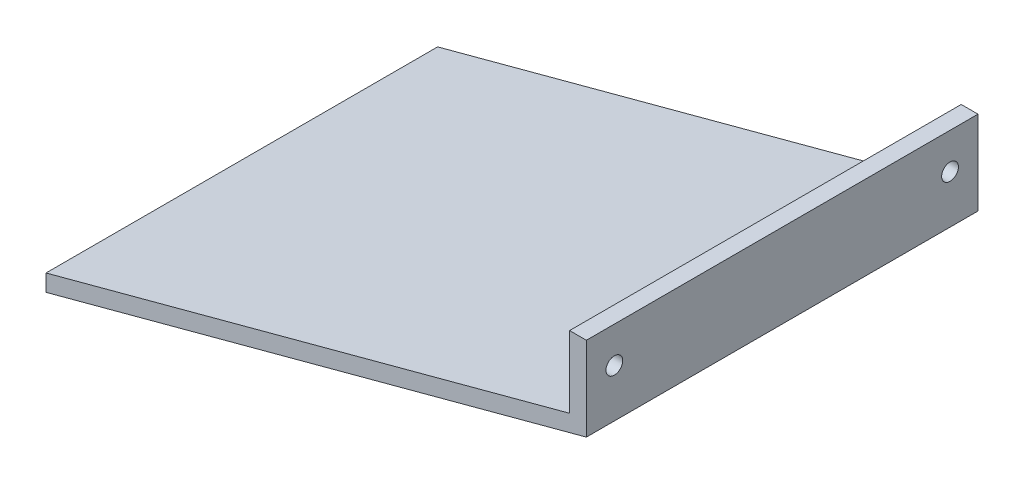
ISO-10303-21;
HEADER;
FILE_DESCRIPTION(('STEP AP214'),'2;1');
FILE_NAME('part.step','',(''),(''),'','','');
FILE_SCHEMA(('AUTOMOTIVE_DESIGN { 1 0 10303 214 1 1 1 1 }'));
ENDSEC;
DATA;
#1=APPLICATION_CONTEXT('core data for automotive mechanical design processes');
#2=APPLICATION_PROTOCOL_DEFINITION('international standard','automotive_design',2000,#1);
#3=PRODUCT_CONTEXT('',#1,'mechanical');
#4=PRODUCT('Part','Part','',(#3));
#5=PRODUCT_RELATED_PRODUCT_CATEGORY('part','',(#4));
#6=PRODUCT_DEFINITION_FORMATION('','',#4);
#7=PRODUCT_DEFINITION_CONTEXT('part definition',#1,'design');
#8=PRODUCT_DEFINITION('design','',#6,#7);
#9=PRODUCT_DEFINITION_SHAPE('','',#8);
#10=(LENGTH_UNIT() NAMED_UNIT(*) SI_UNIT(.MILLI.,.METRE.));
#11=(NAMED_UNIT(*) PLANE_ANGLE_UNIT() SI_UNIT($,.RADIAN.));
#12=(NAMED_UNIT(*) SI_UNIT($,.STERADIAN.) SOLID_ANGLE_UNIT());
#13=UNCERTAINTY_MEASURE_WITH_UNIT(LENGTH_MEASURE(1.E-05),#10,'distance_accuracy_value','');
#14=(GEOMETRIC_REPRESENTATION_CONTEXT(3) GLOBAL_UNCERTAINTY_ASSIGNED_CONTEXT((#13)) GLOBAL_UNIT_ASSIGNED_CONTEXT((#10,
#11,#12)) REPRESENTATION_CONTEXT('',''));
#15=CARTESIAN_POINT('',(0.,0.,0.));
#16=DIRECTION('',(0.,0.,1.));
#17=DIRECTION('',(1.,0.,0.));
#18=AXIS2_PLACEMENT_3D('',#15,#16,#17);
#19=CARTESIAN_POINT('',(-48.9338326903239,-16.6440255352879,70.));
#20=DIRECTION('',(0.258819045102521,-0.965925826289068,0.));
#21=DIRECTION('',(0.965925826289068,0.258819045102521,0.));
#22=AXIS2_PLACEMENT_3D('',#19,#20,#21);
#23=PLANE('',#22);
#24=DIRECTION('',(-0.965925826289068,-0.258819045102521,0.));
#25=VECTOR('',#24,1.);
#26=CARTESIAN_POINT('',(-48.9338326903239,-16.6440255352879,0.));
#27=LINE('',#26,#25);
#28=CARTESIAN_POINT('',(44.6587499385829,8.43403139767086,0.));
#29=VERTEX_POINT('',#28);
#30=CARTESIAN_POINT('',(-48.9338326903239,-16.6440255352879,0.));
#31=VERTEX_POINT('',#30);
#32=EDGE_CURVE('E118',#29,#31,#27,.T.);
#33=ORIENTED_EDGE('',*,*,#32,.T.);
#34=DIRECTION('',(0.,0.,-1.));
#35=VECTOR('',#34,1.);
#36=CARTESIAN_POINT('',(-48.9338326903239,-16.6440255352879,70.));
#37=LINE('',#36,#35);
#38=CARTESIAN_POINT('',(-48.9338326903239,-16.6440255352879,70.));
#39=VERTEX_POINT('',#38);
#40=EDGE_CURVE('E11',#39,#31,#37,.T.);
#41=ORIENTED_EDGE('',*,*,#40,.F.);
#42=DIRECTION('',(-0.965925826289068,-0.258819045102521,0.));
#43=VECTOR('',#42,1.);
#44=CARTESIAN_POINT('',(-48.9338326903239,-16.6440255352879,70.));
#45=LINE('',#44,#43);
#46=CARTESIAN_POINT('',(44.6587499385829,8.43403139767086,70.));
#47=VERTEX_POINT('',#46);
#48=EDGE_CURVE('E130',#47,#39,#45,.T.);
#49=ORIENTED_EDGE('',*,*,#48,.F.);
#50=DIRECTION('',(0.,0.,-1.));
#51=VECTOR('',#50,1.);
#52=CARTESIAN_POINT('',(44.6587499385829,8.43403139767086,70.));
#53=LINE('',#52,#51);
#54=EDGE_CURVE('E114',#47,#29,#53,.T.);
#55=ORIENTED_EDGE('',*,*,#54,.T.);
#56=EDGE_LOOP('',(#33,#41,#49,#55));
#57=FACE_BOUND('',#56,.T.);
#58=ADVANCED_FACE('F35',(#57),#23,.F.);
#59=CARTESIAN_POINT('',(-48.9338326903239,-19.6440255352879,70.));
#60=DIRECTION('',(1.,0.,0.));
#61=DIRECTION('',(0.,0.,-1.));
#62=AXIS2_PLACEMENT_3D('',#59,#60,#61);
#63=PLANE('',#62);
#64=DIRECTION('',(0.,-1.,0.));
#65=VECTOR('',#64,1.);
#66=CARTESIAN_POINT('',(-48.9338326903239,-19.6440255352879,0.));
#67=LINE('',#66,#65);
#68=CARTESIAN_POINT('',(-48.9338326903239,-19.6440255352879,0.));
#69=VERTEX_POINT('',#68);
#70=EDGE_CURVE('E121',#31,#69,#67,.T.);
#71=ORIENTED_EDGE('',*,*,#70,.T.);
#72=DIRECTION('',(0.,0.,-1.));
#73=VECTOR('',#72,1.);
#74=CARTESIAN_POINT('',(-48.9338326903239,-19.6440255352879,70.));
#75=LINE('',#74,#73);
#76=CARTESIAN_POINT('',(-48.9338326903239,-19.6440255352879,70.));
#77=VERTEX_POINT('',#76);
#78=EDGE_CURVE('E43',#77,#69,#75,.T.);
#79=ORIENTED_EDGE('',*,*,#78,.F.);
#80=DIRECTION('',(0.,-1.,0.));
#81=VECTOR('',#80,1.);
#82=CARTESIAN_POINT('',(-48.9338326903239,-19.6440255352879,70.));
#83=LINE('',#82,#81);
#84=EDGE_CURVE('E88',#39,#77,#83,.T.);
#85=ORIENTED_EDGE('',*,*,#84,.F.);
#86=ORIENTED_EDGE('',*,*,#40,.T.);
#87=EDGE_LOOP('',(#71,#79,#85,#86));
#88=FACE_BOUND('',#87,.T.);
#89=ADVANCED_FACE('F157',(#88),#63,.F.);
#90=CARTESIAN_POINT('',(47.6587499385829,6.23787897496424,70.));
#91=DIRECTION('',(-0.258819045102521,0.965925826289068,0.));
#92=DIRECTION('',(-0.965925826289068,-0.258819045102521,0.));
#93=AXIS2_PLACEMENT_3D('',#90,#91,#92);
#94=PLANE('',#93);
#95=DIRECTION('',(0.965925826289068,0.258819045102521,0.));
#96=VECTOR('',#95,1.);
#97=CARTESIAN_POINT('',(47.6587499385829,6.23787897496424,0.));
#98=LINE('',#97,#96);
#99=CARTESIAN_POINT('',(47.6587499385829,6.23787897496424,0.));
#100=VERTEX_POINT('',#99);
#101=EDGE_CURVE('E124',#69,#100,#98,.T.);
#102=ORIENTED_EDGE('',*,*,#101,.T.);
#103=DIRECTION('',(0.,0.,-1.));
#104=VECTOR('',#103,1.);
#105=CARTESIAN_POINT('',(47.6587499385829,6.23787897496424,70.));
#106=LINE('',#105,#104);
#107=CARTESIAN_POINT('',(47.6587499385829,6.23787897496424,70.));
#108=VERTEX_POINT('',#107);
#109=EDGE_CURVE('E109',#108,#100,#106,.T.);
#110=ORIENTED_EDGE('',*,*,#109,.F.);
#111=DIRECTION('',(0.965925826289068,0.258819045102521,0.));
#112=VECTOR('',#111,1.);
#113=CARTESIAN_POINT('',(47.6587499385829,6.23787897496424,70.));
#114=LINE('',#113,#112);
#115=EDGE_CURVE('E101',#77,#108,#114,.T.);
#116=ORIENTED_EDGE('',*,*,#115,.F.);
#117=ORIENTED_EDGE('',*,*,#78,.T.);
#118=EDGE_LOOP('',(#102,#110,#116,#117));
#119=FACE_BOUND('',#118,.T.);
#120=ADVANCED_FACE('F136',(#119),#94,.F.);
#121=CARTESIAN_POINT('',(47.6587499385829,9.23787897496424,70.));
#122=DIRECTION('',(-1.,0.,0.));
#123=DIRECTION('',(0.,0.,1.));
#124=AXIS2_PLACEMENT_3D('',#121,#122,#123);
#125=PLANE('',#124);
#126=CARTESIAN_POINT('',(47.6587499385829,14.8359551863176,65.));
#127=DIRECTION('',(-1.,0.,0.));
#128=DIRECTION('',(0.,0.,1.));
#129=AXIS2_PLACEMENT_3D('',#126,#127,#128);
#130=CIRCLE('',#129,1.5);
#131=CARTESIAN_POINT('',(47.6587499385829,14.8359551863176,66.5));
#132=VERTEX_POINT('',#131);
#133=EDGE_CURVE('E173',#132,#132,#130,.F.);
#134=ORIENTED_EDGE('',*,*,#133,.F.);
#135=EDGE_LOOP('',(#134));
#136=FACE_BOUND('',#135,.T.);
#137=CARTESIAN_POINT('',(47.6587499385829,14.8359551863176,5.));
#138=DIRECTION('',(-1.,0.,0.));
#139=DIRECTION('',(0.,0.,1.));
#140=AXIS2_PLACEMENT_3D('',#137,#138,#139);
#141=CIRCLE('',#140,1.5);
#142=CARTESIAN_POINT('',(47.6587499385829,14.8359551863176,6.5));
#143=VERTEX_POINT('',#142);
#144=EDGE_CURVE('E122',#143,#143,#141,.F.);
#145=ORIENTED_EDGE('',*,*,#144,.F.);
#146=EDGE_LOOP('',(#145));
#147=FACE_BOUND('',#146,.T.);
#148=DIRECTION('',(0.,1.,0.));
#149=VECTOR('',#148,1.);
#150=CARTESIAN_POINT('',(47.6587499385829,9.23787897496424,0.));
#151=LINE('',#150,#149);
#152=CARTESIAN_POINT('',(47.6587499385829,21.2378789749642,0.));
#153=VERTEX_POINT('',#152);
#154=EDGE_CURVE('E108',#100,#153,#151,.T.);
#155=ORIENTED_EDGE('',*,*,#154,.T.);
#156=DIRECTION('',(0.,0.,-1.));
#157=VECTOR('',#156,1.);
#158=CARTESIAN_POINT('',(47.6587499385829,21.2378789749642,70.));
#159=LINE('',#158,#157);
#160=CARTESIAN_POINT('',(47.6587499385829,21.2378789749642,70.));
#161=VERTEX_POINT('',#160);
#162=EDGE_CURVE('E106',#161,#153,#159,.T.);
#163=ORIENTED_EDGE('',*,*,#162,.F.);
#164=DIRECTION('',(0.,1.,0.));
#165=VECTOR('',#164,1.);
#166=CARTESIAN_POINT('',(47.6587499385829,9.23787897496424,70.));
#167=LINE('',#166,#165);
#168=EDGE_CURVE('E95',#108,#161,#167,.T.);
#169=ORIENTED_EDGE('',*,*,#168,.F.);
#170=ORIENTED_EDGE('',*,*,#109,.T.);
#171=EDGE_LOOP('',(#155,#163,#169,#170));
#172=FACE_BOUND('',#171,.T.);
#173=ADVANCED_FACE('F107',(#136,#147,#172),#125,.F.);
#174=CARTESIAN_POINT('',(44.6587499385829,21.2378789749642,70.));
#175=DIRECTION('',(0.,-1.,0.));
#176=DIRECTION('',(0.,0.,-1.));
#177=AXIS2_PLACEMENT_3D('',#174,#175,#176);
#178=PLANE('',#177);
#179=DIRECTION('',(-1.,0.,0.));
#180=VECTOR('',#179,1.);
#181=CARTESIAN_POINT('',(44.6587499385829,21.2378789749642,0.));
#182=LINE('',#181,#180);
#183=CARTESIAN_POINT('',(44.6587499385829,21.2378789749642,0.));
#184=VERTEX_POINT('',#183);
#185=EDGE_CURVE('E74',#153,#184,#182,.T.);
#186=ORIENTED_EDGE('',*,*,#185,.T.);
#187=DIRECTION('',(0.,0.,-1.));
#188=VECTOR('',#187,1.);
#189=CARTESIAN_POINT('',(44.6587499385829,21.2378789749642,70.));
#190=LINE('',#189,#188);
#191=CARTESIAN_POINT('',(44.6587499385829,21.2378789749642,70.));
#192=VERTEX_POINT('',#191);
#193=EDGE_CURVE('E110',#192,#184,#190,.T.);
#194=ORIENTED_EDGE('',*,*,#193,.F.);
#195=DIRECTION('',(-1.,0.,0.));
#196=VECTOR('',#195,1.);
#197=CARTESIAN_POINT('',(44.6587499385829,21.2378789749642,70.));
#198=LINE('',#197,#196);
#199=EDGE_CURVE('E99',#161,#192,#198,.T.);
#200=ORIENTED_EDGE('',*,*,#199,.F.);
#201=ORIENTED_EDGE('',*,*,#162,.T.);
#202=EDGE_LOOP('',(#186,#194,#200,#201));
#203=FACE_BOUND('',#202,.T.);
#204=ADVANCED_FACE('F112',(#203),#178,.F.);
#205=CARTESIAN_POINT('',(44.6587499385829,21.2378789749642,70.));
#206=DIRECTION('',(1.,0.,0.));
#207=DIRECTION('',(0.,1.,0.));
#208=AXIS2_PLACEMENT_3D('',#205,#206,#207);
#209=PLANE('',#208);
#210=CARTESIAN_POINT('',(44.6587499385829,14.8359551863176,65.));
#211=DIRECTION('',(-1.,0.,0.));
#212=DIRECTION('',(0.,-1.,0.));
#213=AXIS2_PLACEMENT_3D('',#210,#211,#212);
#214=CIRCLE('',#213,1.5);
#215=CARTESIAN_POINT('',(44.6587499385829,13.3359551863176,65.));
#216=VERTEX_POINT('',#215);
#217=EDGE_CURVE('E185',#216,#216,#214,.T.);
#218=ORIENTED_EDGE('',*,*,#217,.F.);
#219=EDGE_LOOP('',(#218));
#220=FACE_BOUND('',#219,.T.);
#221=CARTESIAN_POINT('',(44.6587499385829,14.8359551863176,5.));
#222=DIRECTION('',(-1.,0.,0.));
#223=DIRECTION('',(0.,-1.,0.));
#224=AXIS2_PLACEMENT_3D('',#221,#222,#223);
#225=CIRCLE('',#224,1.5);
#226=CARTESIAN_POINT('',(44.6587499385829,13.3359551863176,5.));
#227=VERTEX_POINT('',#226);
#228=EDGE_CURVE('E177',#227,#227,#225,.T.);
#229=ORIENTED_EDGE('',*,*,#228,.F.);
#230=EDGE_LOOP('',(#229));
#231=FACE_BOUND('',#230,.T.);
#232=DIRECTION('',(0.,-1.,0.));
#233=VECTOR('',#232,1.);
#234=CARTESIAN_POINT('',(44.6587499385829,21.2378789749642,0.));
#235=LINE('',#234,#233);
#236=EDGE_CURVE('E80',#184,#29,#235,.T.);
#237=ORIENTED_EDGE('',*,*,#236,.T.);
#238=ORIENTED_EDGE('',*,*,#54,.F.);
#239=DIRECTION('',(0.,-1.,0.));
#240=VECTOR('',#239,1.);
#241=CARTESIAN_POINT('',(44.6587499385829,21.2378789749642,70.));
#242=LINE('',#241,#240);
#243=EDGE_CURVE('E51',#192,#47,#242,.T.);
#244=ORIENTED_EDGE('',*,*,#243,.F.);
#245=ORIENTED_EDGE('',*,*,#193,.T.);
#246=EDGE_LOOP('',(#237,#238,#244,#245));
#247=FACE_BOUND('',#246,.T.);
#248=ADVANCED_FACE('F143',(#220,#231,#247),#209,.F.);
#249=CARTESIAN_POINT('',(0.,0.,70.));
#250=DIRECTION('',(0.,0.,-1.));
#251=DIRECTION('',(-1.,0.,0.));
#252=AXIS2_PLACEMENT_3D('',#249,#250,#251);
#253=PLANE('',#252);
#254=ORIENTED_EDGE('',*,*,#48,.T.);
#255=ORIENTED_EDGE('',*,*,#84,.T.);
#256=ORIENTED_EDGE('',*,*,#115,.T.);
#257=ORIENTED_EDGE('',*,*,#168,.T.);
#258=ORIENTED_EDGE('',*,*,#199,.T.);
#259=ORIENTED_EDGE('',*,*,#243,.T.);
#260=EDGE_LOOP('',(#254,#255,#256,#257,#258,#259));
#261=FACE_BOUND('',#260,.T.);
#262=ADVANCED_FACE('F97',(#261),#253,.F.);
#263=CARTESIAN_POINT('',(0.,0.,0.));
#264=DIRECTION('',(0.,0.,-1.));
#265=DIRECTION('',(-1.,0.,0.));
#266=AXIS2_PLACEMENT_3D('',#263,#264,#265);
#267=PLANE('',#266);
#268=ORIENTED_EDGE('',*,*,#32,.F.);
#269=ORIENTED_EDGE('',*,*,#236,.F.);
#270=ORIENTED_EDGE('',*,*,#185,.F.);
#271=ORIENTED_EDGE('',*,*,#154,.F.);
#272=ORIENTED_EDGE('',*,*,#101,.F.);
#273=ORIENTED_EDGE('',*,*,#70,.F.);
#274=EDGE_LOOP('',(#268,#269,#270,#271,#272,#273));
#275=FACE_BOUND('',#274,.T.);
#276=ADVANCED_FACE('F139',(#275),#267,.T.);
#277=CARTESIAN_POINT('',(47.6597499385829,14.8359551863176,5.));
#278=DIRECTION('',(-1.,0.,0.));
#279=DIRECTION('',(0.,-1.,0.));
#280=AXIS2_PLACEMENT_3D('',#277,#278,#279);
#281=CYLINDRICAL_SURFACE('',#280,1.5);
#282=ORIENTED_EDGE('',*,*,#228,.T.);
#283=EDGE_LOOP('',(#282));
#284=FACE_BOUND('',#283,.T.);
#285=ORIENTED_EDGE('',*,*,#144,.T.);
#286=EDGE_LOOP('',(#285));
#287=FACE_BOUND('',#286,.T.);
#288=ADVANCED_FACE('F191',(#284,#287),#281,.F.);
#289=CARTESIAN_POINT('',(47.6597499385829,14.8359551863176,65.));
#290=DIRECTION('',(-1.,0.,0.));
#291=DIRECTION('',(0.,-1.,0.));
#292=AXIS2_PLACEMENT_3D('',#289,#290,#291);
#293=CYLINDRICAL_SURFACE('',#292,1.5);
#294=ORIENTED_EDGE('',*,*,#217,.T.);
#295=EDGE_LOOP('',(#294));
#296=FACE_BOUND('',#295,.T.);
#297=ORIENTED_EDGE('',*,*,#133,.T.);
#298=EDGE_LOOP('',(#297));
#299=FACE_BOUND('',#298,.T.);
#300=ADVANCED_FACE('F188',(#296,#299),#293,.F.);
#301=CLOSED_SHELL('',(#58,#89,#120,#173,#204,#248,#262,#276,#288,#300));
#302=MANIFOLD_SOLID_BREP('B2',#301);
#303=ADVANCED_BREP_SHAPE_REPRESENTATION('',(#18,#302),#14);
#304=SHAPE_DEFINITION_REPRESENTATION(#9,#303);
ENDSEC;
END-ISO-10303-21;
